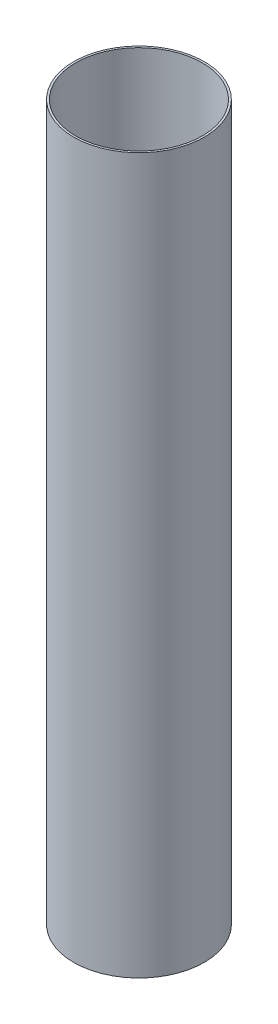
ISO-10303-21;
HEADER;
FILE_DESCRIPTION(('STEP AP214'),'2;1');
FILE_NAME('part.step','',(''),(''),'','','');
FILE_SCHEMA(('AUTOMOTIVE_DESIGN { 1 0 10303 214 1 1 1 1 }'));
ENDSEC;
DATA;
#1=APPLICATION_CONTEXT('core data for automotive mechanical design processes');
#2=APPLICATION_PROTOCOL_DEFINITION('international standard','automotive_design',2000,#1);
#3=PRODUCT_CONTEXT('',#1,'mechanical');
#4=PRODUCT('Part','Part','',(#3));
#5=PRODUCT_RELATED_PRODUCT_CATEGORY('part','',(#4));
#6=PRODUCT_DEFINITION_FORMATION('','',#4);
#7=PRODUCT_DEFINITION_CONTEXT('part definition',#1,'design');
#8=PRODUCT_DEFINITION('design','',#6,#7);
#9=PRODUCT_DEFINITION_SHAPE('','',#8);
#10=(LENGTH_UNIT() NAMED_UNIT(*) SI_UNIT(.MILLI.,.METRE.));
#11=(NAMED_UNIT(*) PLANE_ANGLE_UNIT() SI_UNIT($,.RADIAN.));
#12=(NAMED_UNIT(*) SI_UNIT($,.STERADIAN.) SOLID_ANGLE_UNIT());
#13=UNCERTAINTY_MEASURE_WITH_UNIT(LENGTH_MEASURE(1.E-05),#10,'distance_accuracy_value','');
#14=(GEOMETRIC_REPRESENTATION_CONTEXT(3) GLOBAL_UNCERTAINTY_ASSIGNED_CONTEXT((#13)) GLOBAL_UNIT_ASSIGNED_CONTEXT((#10,
#11,#12)) REPRESENTATION_CONTEXT('',''));
#15=CARTESIAN_POINT('',(0.,0.,0.));
#16=DIRECTION('',(0.,0.,1.));
#17=DIRECTION('',(1.,0.,0.));
#18=AXIS2_PLACEMENT_3D('',#15,#16,#17);
#19=CARTESIAN_POINT('',(0.,558.8,0.));
#20=DIRECTION('',(0.,1.,0.));
#21=DIRECTION('',(0.,0.,1.));
#22=AXIS2_PLACEMENT_3D('',#19,#20,#21);
#23=PLANE('',#22);
#24=CARTESIAN_POINT('',(0.,558.8,0.));
#25=DIRECTION('',(0.,1.,0.));
#26=DIRECTION('',(0.,0.,1.));
#27=AXIS2_PLACEMENT_3D('',#24,#25,#26);
#28=CIRCLE('',#27,51.1048);
#29=CARTESIAN_POINT('',(0.,558.8,51.1048));
#30=VERTEX_POINT('',#29);
#31=EDGE_CURVE('E10',#30,#30,#28,.T.);
#32=ORIENTED_EDGE('',*,*,#31,.T.);
#33=EDGE_LOOP('',(#32));
#34=FACE_BOUND('',#33,.T.);
#35=CARTESIAN_POINT('',(0.,558.8,0.));
#36=DIRECTION('',(0.,1.,0.));
#37=DIRECTION('',(0.,0.,1.));
#38=AXIS2_PLACEMENT_3D('',#35,#36,#37);
#39=CIRCLE('',#38,49.53);
#40=CARTESIAN_POINT('',(0.,558.8,49.53));
#41=VERTEX_POINT('',#40);
#42=EDGE_CURVE('E54',#41,#41,#39,.T.);
#43=ORIENTED_EDGE('',*,*,#42,.F.);
#44=EDGE_LOOP('',(#43));
#45=FACE_BOUND('',#44,.T.);
#46=ADVANCED_FACE('F41',(#34,#45),#23,.T.);
#47=CARTESIAN_POINT('',(0.,0.,0.));
#48=DIRECTION('',(0.,1.,0.));
#49=DIRECTION('',(0.,0.,1.));
#50=AXIS2_PLACEMENT_3D('',#47,#48,#49);
#51=PLANE('',#50);
#52=CARTESIAN_POINT('',(0.,0.,0.));
#53=DIRECTION('',(0.,1.,0.));
#54=DIRECTION('',(0.,0.,1.));
#55=AXIS2_PLACEMENT_3D('',#52,#53,#54);
#56=CIRCLE('',#55,51.1048);
#57=CARTESIAN_POINT('',(0.,0.,51.1048));
#58=VERTEX_POINT('',#57);
#59=EDGE_CURVE('E45',#58,#58,#56,.T.);
#60=ORIENTED_EDGE('',*,*,#59,.F.);
#61=EDGE_LOOP('',(#60));
#62=FACE_BOUND('',#61,.T.);
#63=CARTESIAN_POINT('',(0.,0.,0.));
#64=DIRECTION('',(0.,1.,0.));
#65=DIRECTION('',(0.,0.,1.));
#66=AXIS2_PLACEMENT_3D('',#63,#64,#65);
#67=CIRCLE('',#66,49.53);
#68=CARTESIAN_POINT('',(0.,0.,49.53));
#69=VERTEX_POINT('',#68);
#70=EDGE_CURVE('E56',#69,#69,#67,.T.);
#71=ORIENTED_EDGE('',*,*,#70,.T.);
#72=EDGE_LOOP('',(#71));
#73=FACE_BOUND('',#72,.T.);
#74=ADVANCED_FACE('F68',(#62,#73),#51,.F.);
#75=CARTESIAN_POINT('',(0.,558.8,0.));
#76=DIRECTION('',(0.,-1.,0.));
#77=DIRECTION('',(0.,0.,-1.));
#78=AXIS2_PLACEMENT_3D('',#75,#76,#77);
#79=CYLINDRICAL_SURFACE('',#78,51.1048);
#80=ORIENTED_EDGE('',*,*,#31,.F.);
#81=EDGE_LOOP('',(#80));
#82=FACE_BOUND('',#81,.T.);
#83=ORIENTED_EDGE('',*,*,#59,.T.);
#84=EDGE_LOOP('',(#83));
#85=FACE_BOUND('',#84,.T.);
#86=ADVANCED_FACE('F43',(#82,#85),#79,.T.);
#87=CARTESIAN_POINT('',(0.,558.8,0.));
#88=DIRECTION('',(0.,-1.,0.));
#89=DIRECTION('',(0.,0.,-1.));
#90=AXIS2_PLACEMENT_3D('',#87,#88,#89);
#91=CYLINDRICAL_SURFACE('',#90,49.53);
#92=ORIENTED_EDGE('',*,*,#42,.T.);
#93=EDGE_LOOP('',(#92));
#94=FACE_BOUND('',#93,.T.);
#95=ORIENTED_EDGE('',*,*,#70,.F.);
#96=EDGE_LOOP('',(#95));
#97=FACE_BOUND('',#96,.T.);
#98=ADVANCED_FACE('F64',(#94,#97),#91,.F.);
#99=CLOSED_SHELL('',(#46,#74,#86,#98));
#100=MANIFOLD_SOLID_BREP('B2',#99);
#101=ADVANCED_BREP_SHAPE_REPRESENTATION('',(#18,#100),#14);
#102=SHAPE_DEFINITION_REPRESENTATION(#9,#101);
ENDSEC;
END-ISO-10303-21;
